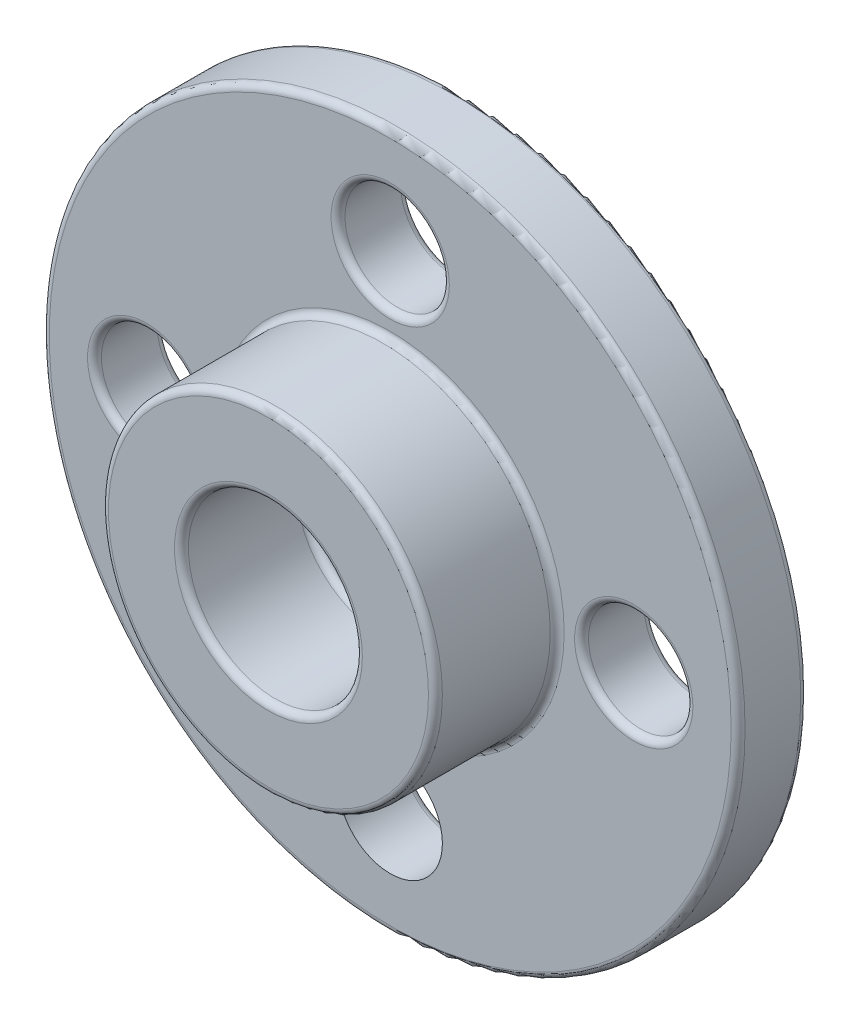
ISO-10303-21;
HEADER;
FILE_DESCRIPTION(('STEP AP214'),'2;1');
FILE_NAME('part.step','',(''),(''),'','','');
FILE_SCHEMA(('AUTOMOTIVE_DESIGN { 1 0 10303 214 1 1 1 1 }'));
ENDSEC;
DATA;
#1=APPLICATION_CONTEXT('core data for automotive mechanical design processes');
#2=APPLICATION_PROTOCOL_DEFINITION('international standard','automotive_design',2000,#1);
#3=PRODUCT_CONTEXT('',#1,'mechanical');
#4=PRODUCT('Part','Part','',(#3));
#5=PRODUCT_RELATED_PRODUCT_CATEGORY('part','',(#4));
#6=PRODUCT_DEFINITION_FORMATION('','',#4);
#7=PRODUCT_DEFINITION_CONTEXT('part definition',#1,'design');
#8=PRODUCT_DEFINITION('design','',#6,#7);
#9=PRODUCT_DEFINITION_SHAPE('','',#8);
#10=(LENGTH_UNIT() NAMED_UNIT(*) SI_UNIT(.MILLI.,.METRE.));
#11=(NAMED_UNIT(*) PLANE_ANGLE_UNIT() SI_UNIT($,.RADIAN.));
#12=(NAMED_UNIT(*) SI_UNIT($,.STERADIAN.) SOLID_ANGLE_UNIT());
#13=UNCERTAINTY_MEASURE_WITH_UNIT(LENGTH_MEASURE(1.E-05),#10,'distance_accuracy_value','');
#14=(GEOMETRIC_REPRESENTATION_CONTEXT(3) GLOBAL_UNCERTAINTY_ASSIGNED_CONTEXT((#13)) GLOBAL_UNIT_ASSIGNED_CONTEXT((#10,
#11,#12)) REPRESENTATION_CONTEXT('',''));
#15=CARTESIAN_POINT('',(0.,0.,0.));
#16=DIRECTION('',(0.,0.,1.));
#17=DIRECTION('',(1.,0.,0.));
#18=AXIS2_PLACEMENT_3D('',#15,#16,#17);
#19=CARTESIAN_POINT('',(0.,0.,2.));
#20=DIRECTION('',(0.,0.,-1.));
#21=DIRECTION('',(-1.,0.,0.));
#22=AXIS2_PLACEMENT_3D('',#19,#20,#21);
#23=CYLINDRICAL_SURFACE('',#22,1.65);
#24=CARTESIAN_POINT('',(0.,0.,1.8));
#25=DIRECTION('',(0.,0.,1.));
#26=DIRECTION('',(1.,0.,0.));
#27=AXIS2_PLACEMENT_3D('',#24,#25,#26);
#28=CIRCLE('',#27,1.65);
#29=CARTESIAN_POINT('',(1.65,0.,1.8));
#30=VERTEX_POINT('',#29);
#31=EDGE_CURVE('E89',#30,#30,#28,.T.);
#32=ORIENTED_EDGE('',*,*,#31,.T.);
#33=EDGE_LOOP('',(#32));
#34=FACE_BOUND('',#33,.T.);
#35=CARTESIAN_POINT('',(0.,0.,0.2));
#36=DIRECTION('',(0.,0.,1.));
#37=DIRECTION('',(1.,0.,0.));
#38=AXIS2_PLACEMENT_3D('',#35,#36,#37);
#39=CIRCLE('',#38,1.65);
#40=CARTESIAN_POINT('',(1.65,0.,0.2));
#41=VERTEX_POINT('',#40);
#42=EDGE_CURVE('E92',#41,#41,#39,.F.);
#43=ORIENTED_EDGE('',*,*,#42,.T.);
#44=EDGE_LOOP('',(#43));
#45=FACE_BOUND('',#44,.T.);
#46=ADVANCED_FACE('F42',(#34,#45),#23,.F.);
#47=CARTESIAN_POINT('',(0.,0.,2.));
#48=DIRECTION('',(0.,0.,1.));
#49=DIRECTION('',(1.,0.,0.));
#50=AXIS2_PLACEMENT_3D('',#47,#48,#49);
#51=PLANE('',#50);
#52=CARTESIAN_POINT('',(0.,0.,2.));
#53=DIRECTION('',(0.,0.,1.));
#54=DIRECTION('',(1.,0.,0.));
#55=AXIS2_PLACEMENT_3D('',#52,#53,#54);
#56=CIRCLE('',#55,1.85);
#57=CARTESIAN_POINT('',(1.85,0.,2.));
#58=VERTEX_POINT('',#57);
#59=EDGE_CURVE('E83',#58,#58,#56,.F.);
#60=ORIENTED_EDGE('',*,*,#59,.T.);
#61=EDGE_LOOP('',(#60));
#62=FACE_BOUND('',#61,.T.);
#63=CARTESIAN_POINT('',(0.,0.,2.));
#64=DIRECTION('',(0.,0.,1.));
#65=DIRECTION('',(1.,0.,0.));
#66=AXIS2_PLACEMENT_3D('',#63,#64,#65);
#67=CIRCLE('',#66,2.3);
#68=CARTESIAN_POINT('',(2.3,0.,2.));
#69=VERTEX_POINT('',#68);
#70=EDGE_CURVE('E86',#69,#69,#67,.T.);
#71=ORIENTED_EDGE('',*,*,#70,.T.);
#72=EDGE_LOOP('',(#71));
#73=FACE_BOUND('',#72,.T.);
#74=ADVANCED_FACE('F164',(#62,#73),#51,.T.);
#75=CARTESIAN_POINT('',(0.,0.,0.));
#76=DIRECTION('',(0.,0.,1.));
#77=DIRECTION('',(1.,0.,0.));
#78=AXIS2_PLACEMENT_3D('',#75,#76,#77);
#79=PLANE('',#78);
#80=CARTESIAN_POINT('',(-7.,0.,0.));
#81=DIRECTION('',(0.,0.,1.));
#82=DIRECTION('',(1.,0.,0.));
#83=AXIS2_PLACEMENT_3D('',#80,#81,#82);
#84=CIRCLE('',#83,1.70000000000007);
#85=CARTESIAN_POINT('',(-5.29999999999993,0.,0.));
#86=VERTEX_POINT('',#85);
#87=EDGE_CURVE('E49',#86,#86,#84,.T.);
#88=ORIENTED_EDGE('',*,*,#87,.T.);
#89=EDGE_LOOP('',(#88));
#90=FACE_BOUND('',#89,.T.);
#91=CARTESIAN_POINT('',(0.,7.,0.));
#92=DIRECTION('',(0.,0.,1.));
#93=DIRECTION('',(1.,0.,0.));
#94=AXIS2_PLACEMENT_3D('',#91,#92,#93);
#95=CIRCLE('',#94,1.7);
#96=CARTESIAN_POINT('',(1.7,7.,0.));
#97=VERTEX_POINT('',#96);
#98=EDGE_CURVE('E53',#97,#97,#95,.T.);
#99=ORIENTED_EDGE('',*,*,#98,.T.);
#100=EDGE_LOOP('',(#99));
#101=FACE_BOUND('',#100,.T.);
#102=CARTESIAN_POINT('',(7.,0.,0.));
#103=DIRECTION('',(0.,0.,1.));
#104=DIRECTION('',(1.,0.,0.));
#105=AXIS2_PLACEMENT_3D('',#102,#103,#104);
#106=CIRCLE('',#105,1.70000000000002);
#107=CARTESIAN_POINT('',(8.70000000000002,0.,0.));
#108=VERTEX_POINT('',#107);
#109=EDGE_CURVE('E57',#108,#108,#106,.T.);
#110=ORIENTED_EDGE('',*,*,#109,.T.);
#111=EDGE_LOOP('',(#110));
#112=FACE_BOUND('',#111,.T.);
#113=CARTESIAN_POINT('',(0.,-7.,0.));
#114=DIRECTION('',(0.,0.,1.));
#115=DIRECTION('',(1.,0.,0.));
#116=AXIS2_PLACEMENT_3D('',#113,#114,#115);
#117=CIRCLE('',#116,1.70000000000005);
#118=CARTESIAN_POINT('',(1.70000000000005,-7.,0.));
#119=VERTEX_POINT('',#118);
#120=EDGE_CURVE('E62',#119,#119,#117,.T.);
#121=ORIENTED_EDGE('',*,*,#120,.T.);
#122=EDGE_LOOP('',(#121));
#123=FACE_BOUND('',#122,.T.);
#124=CARTESIAN_POINT('',(0.,0.,0.));
#125=DIRECTION('',(0.,0.,1.));
#126=DIRECTION('',(1.,0.,0.));
#127=AXIS2_PLACEMENT_3D('',#124,#125,#126);
#128=CIRCLE('',#127,1.85);
#129=CARTESIAN_POINT('',(1.85,0.,0.));
#130=VERTEX_POINT('',#129);
#131=EDGE_CURVE('E65',#130,#130,#128,.T.);
#132=ORIENTED_EDGE('',*,*,#131,.T.);
#133=EDGE_LOOP('',(#132));
#134=FACE_BOUND('',#133,.T.);
#135=CARTESIAN_POINT('',(0.,0.,0.));
#136=DIRECTION('',(0.,0.,1.));
#137=DIRECTION('',(1.,0.,0.));
#138=AXIS2_PLACEMENT_3D('',#135,#136,#137);
#139=CIRCLE('',#138,9.8);
#140=CARTESIAN_POINT('',(9.8,0.,0.));
#141=VERTEX_POINT('',#140);
#142=EDGE_CURVE('E68',#141,#141,#139,.F.);
#143=ORIENTED_EDGE('',*,*,#142,.T.);
#144=EDGE_LOOP('',(#143));
#145=FACE_BOUND('',#144,.T.);
#146=ADVANCED_FACE('F170',(#90,#101,#112,#123,#134,#145),#79,.F.);
#147=CARTESIAN_POINT('',(0.,0.,5.5));
#148=DIRECTION('',(0.,0.,-1.));
#149=DIRECTION('',(-1.,0.,0.));
#150=AXIS2_PLACEMENT_3D('',#147,#148,#149);
#151=CYLINDRICAL_SURFACE('',#150,2.5);
#152=CARTESIAN_POINT('',(0.,0.,2.2));
#153=DIRECTION('',(0.,0.,1.));
#154=DIRECTION('',(1.,0.,0.));
#155=AXIS2_PLACEMENT_3D('',#152,#153,#154);
#156=CIRCLE('',#155,2.5);
#157=CARTESIAN_POINT('',(2.5,0.,2.2));
#158=VERTEX_POINT('',#157);
#159=EDGE_CURVE('E77',#158,#158,#156,.F.);
#160=ORIENTED_EDGE('',*,*,#159,.T.);
#161=EDGE_LOOP('',(#160));
#162=FACE_BOUND('',#161,.T.);
#163=CARTESIAN_POINT('',(0.,0.,5.3));
#164=DIRECTION('',(0.,0.,1.));
#165=DIRECTION('',(1.,0.,0.));
#166=AXIS2_PLACEMENT_3D('',#163,#164,#165);
#167=CIRCLE('',#166,2.5);
#168=CARTESIAN_POINT('',(2.5,0.,5.3));
#169=VERTEX_POINT('',#168);
#170=EDGE_CURVE('E80',#169,#169,#167,.T.);
#171=ORIENTED_EDGE('',*,*,#170,.T.);
#172=EDGE_LOOP('',(#171));
#173=FACE_BOUND('',#172,.T.);
#174=ADVANCED_FACE('F235',(#162,#173),#151,.F.);
#175=CARTESIAN_POINT('',(0.,0.,5.5));
#176=DIRECTION('',(0.,0.,-1.));
#177=DIRECTION('',(-1.,0.,0.));
#178=AXIS2_PLACEMENT_3D('',#175,#176,#177);
#179=CYLINDRICAL_SURFACE('',#178,4.8);
#180=CARTESIAN_POINT('',(0.,0.,2.2));
#181=DIRECTION('',(0.,0.,1.));
#182=DIRECTION('',(1.,0.,0.));
#183=AXIS2_PLACEMENT_3D('',#180,#181,#182);
#184=CIRCLE('',#183,4.8);
#185=CARTESIAN_POINT('',(4.8,0.,2.2));
#186=VERTEX_POINT('',#185);
#187=EDGE_CURVE('E95',#186,#186,#184,.T.);
#188=ORIENTED_EDGE('',*,*,#187,.T.);
#189=EDGE_LOOP('',(#188));
#190=FACE_BOUND('',#189,.T.);
#191=CARTESIAN_POINT('',(0.,0.,5.3));
#192=DIRECTION('',(0.,0.,1.));
#193=DIRECTION('',(1.,0.,0.));
#194=AXIS2_PLACEMENT_3D('',#191,#192,#193);
#195=CIRCLE('',#194,4.8);
#196=CARTESIAN_POINT('',(4.8,0.,5.3));
#197=VERTEX_POINT('',#196);
#198=EDGE_CURVE('E98',#197,#197,#195,.F.);
#199=ORIENTED_EDGE('',*,*,#198,.T.);
#200=EDGE_LOOP('',(#199));
#201=FACE_BOUND('',#200,.T.);
#202=ADVANCED_FACE('F239',(#190,#201),#179,.T.);
#203=CARTESIAN_POINT('',(0.,0.,5.5));
#204=DIRECTION('',(0.,0.,1.));
#205=DIRECTION('',(1.,0.,0.));
#206=AXIS2_PLACEMENT_3D('',#203,#204,#205);
#207=PLANE('',#206);
#208=CARTESIAN_POINT('',(0.,0.,5.5));
#209=DIRECTION('',(0.,0.,1.));
#210=DIRECTION('',(1.,0.,0.));
#211=AXIS2_PLACEMENT_3D('',#208,#209,#210);
#212=CIRCLE('',#211,2.7);
#213=CARTESIAN_POINT('',(2.7,0.,5.5));
#214=VERTEX_POINT('',#213);
#215=EDGE_CURVE('E71',#214,#214,#212,.F.);
#216=ORIENTED_EDGE('',*,*,#215,.T.);
#217=EDGE_LOOP('',(#216));
#218=FACE_BOUND('',#217,.T.);
#219=CARTESIAN_POINT('',(0.,0.,5.5));
#220=DIRECTION('',(0.,0.,1.));
#221=DIRECTION('',(1.,0.,0.));
#222=AXIS2_PLACEMENT_3D('',#219,#220,#221);
#223=CIRCLE('',#222,4.6);
#224=CARTESIAN_POINT('',(4.6,0.,5.5));
#225=VERTEX_POINT('',#224);
#226=EDGE_CURVE('E74',#225,#225,#223,.T.);
#227=ORIENTED_EDGE('',*,*,#226,.T.);
#228=EDGE_LOOP('',(#227));
#229=FACE_BOUND('',#228,.T.);
#230=ADVANCED_FACE('F257',(#218,#229),#207,.T.);
#231=CARTESIAN_POINT('',(0.,7.,2.));
#232=DIRECTION('',(0.,0.,-1.));
#233=DIRECTION('',(-1.,0.,0.));
#234=AXIS2_PLACEMENT_3D('',#231,#232,#233);
#235=CYLINDRICAL_SURFACE('',#234,1.5);
#236=CARTESIAN_POINT('',(0.,7.,1.8));
#237=DIRECTION('',(0.,0.,1.));
#238=DIRECTION('',(1.,0.,0.));
#239=AXIS2_PLACEMENT_3D('',#236,#237,#238);
#240=CIRCLE('',#239,1.5);
#241=CARTESIAN_POINT('',(1.5,7.,1.8));
#242=VERTEX_POINT('',#241);
#243=EDGE_CURVE('E107',#242,#242,#240,.T.);
#244=ORIENTED_EDGE('',*,*,#243,.T.);
#245=EDGE_LOOP('',(#244));
#246=FACE_BOUND('',#245,.T.);
#247=CARTESIAN_POINT('',(0.,7.,0.2));
#248=DIRECTION('',(0.,0.,1.));
#249=DIRECTION('',(1.,0.,0.));
#250=AXIS2_PLACEMENT_3D('',#247,#248,#249);
#251=CIRCLE('',#250,1.5);
#252=CARTESIAN_POINT('',(1.5,7.,0.2));
#253=VERTEX_POINT('',#252);
#254=EDGE_CURVE('E110',#253,#253,#251,.F.);
#255=ORIENTED_EDGE('',*,*,#254,.T.);
#256=EDGE_LOOP('',(#255));
#257=FACE_BOUND('',#256,.T.);
#258=ADVANCED_FACE('F264',(#246,#257),#235,.F.);
#259=CARTESIAN_POINT('',(7.,0.,2.));
#260=DIRECTION('',(0.,0.,-1.));
#261=DIRECTION('',(-1.,0.,0.));
#262=AXIS2_PLACEMENT_3D('',#259,#260,#261);
#263=CYLINDRICAL_SURFACE('',#262,1.50000000000002);
#264=CARTESIAN_POINT('',(7.,0.,1.8));
#265=DIRECTION('',(0.,0.,1.));
#266=DIRECTION('',(1.,0.,0.));
#267=AXIS2_PLACEMENT_3D('',#264,#265,#266);
#268=CIRCLE('',#267,1.50000000000002);
#269=CARTESIAN_POINT('',(8.50000000000002,0.,1.8));
#270=VERTEX_POINT('',#269);
#271=EDGE_CURVE('E134',#270,#270,#268,.T.);
#272=ORIENTED_EDGE('',*,*,#271,.T.);
#273=EDGE_LOOP('',(#272));
#274=FACE_BOUND('',#273,.T.);
#275=CARTESIAN_POINT('',(7.,0.,0.2));
#276=DIRECTION('',(0.,0.,1.));
#277=DIRECTION('',(1.,0.,0.));
#278=AXIS2_PLACEMENT_3D('',#275,#276,#277);
#279=CIRCLE('',#278,1.50000000000002);
#280=CARTESIAN_POINT('',(8.50000000000002,0.,0.2));
#281=VERTEX_POINT('',#280);
#282=EDGE_CURVE('E137',#281,#281,#279,.F.);
#283=ORIENTED_EDGE('',*,*,#282,.T.);
#284=EDGE_LOOP('',(#283));
#285=FACE_BOUND('',#284,.T.);
#286=ADVANCED_FACE('F271',(#274,#285),#263,.F.);
#287=CARTESIAN_POINT('',(0.,-7.,2.));
#288=DIRECTION('',(0.,0.,-1.));
#289=DIRECTION('',(-1.,0.,0.));
#290=AXIS2_PLACEMENT_3D('',#287,#288,#289);
#291=CYLINDRICAL_SURFACE('',#290,1.50000000000005);
#292=CARTESIAN_POINT('',(0.,-7.,0.2));
#293=DIRECTION('',(0.,0.,1.));
#294=DIRECTION('',(1.,0.,0.));
#295=AXIS2_PLACEMENT_3D('',#292,#293,#294);
#296=CIRCLE('',#295,1.50000000000005);
#297=CARTESIAN_POINT('',(1.50000000000005,-7.,0.2));
#298=VERTEX_POINT('',#297);
#299=EDGE_CURVE('E11',#298,#298,#296,.F.);
#300=ORIENTED_EDGE('',*,*,#299,.T.);
#301=EDGE_LOOP('',(#300));
#302=FACE_BOUND('',#301,.T.);
#303=CARTESIAN_POINT('',(0.,-7.,2.));
#304=DIRECTION('',(0.,0.,1.));
#305=DIRECTION('',(1.,0.,0.));
#306=AXIS2_PLACEMENT_3D('',#303,#304,#305);
#307=CIRCLE('',#306,1.50000000000005);
#308=CARTESIAN_POINT('',(1.50000000000005,-7.,2.));
#309=VERTEX_POINT('',#308);
#310=EDGE_CURVE('E140',#309,#309,#307,.T.);
#311=ORIENTED_EDGE('',*,*,#310,.T.);
#312=EDGE_LOOP('',(#311));
#313=FACE_BOUND('',#312,.T.);
#314=ADVANCED_FACE('F144',(#302,#313),#291,.F.);
#315=CARTESIAN_POINT('',(-7.,0.,2.));
#316=DIRECTION('',(0.,0.,-1.));
#317=DIRECTION('',(-1.,0.,0.));
#318=AXIS2_PLACEMENT_3D('',#315,#316,#317);
#319=CYLINDRICAL_SURFACE('',#318,1.50000000000007);
#320=CARTESIAN_POINT('',(-7.,0.,1.8));
#321=DIRECTION('',(0.,0.,1.));
#322=DIRECTION('',(1.,0.,0.));
#323=AXIS2_PLACEMENT_3D('',#320,#321,#322);
#324=CIRCLE('',#323,1.50000000000007);
#325=CARTESIAN_POINT('',(-5.49999999999993,0.,1.8));
#326=VERTEX_POINT('',#325);
#327=EDGE_CURVE('E113',#326,#326,#324,.T.);
#328=ORIENTED_EDGE('',*,*,#327,.T.);
#329=EDGE_LOOP('',(#328));
#330=FACE_BOUND('',#329,.T.);
#331=CARTESIAN_POINT('',(-7.,0.,0.2));
#332=DIRECTION('',(0.,0.,1.));
#333=DIRECTION('',(1.,0.,0.));
#334=AXIS2_PLACEMENT_3D('',#331,#332,#333);
#335=CIRCLE('',#334,1.50000000000007);
#336=CARTESIAN_POINT('',(-5.49999999999993,0.,0.2));
#337=VERTEX_POINT('',#336);
#338=EDGE_CURVE('E116',#337,#337,#335,.F.);
#339=ORIENTED_EDGE('',*,*,#338,.T.);
#340=EDGE_LOOP('',(#339));
#341=FACE_BOUND('',#340,.T.);
#342=ADVANCED_FACE('F159',(#330,#341),#319,.F.);
#343=CARTESIAN_POINT('',(0.,0.,2.));
#344=DIRECTION('',(0.,0.,-1.));
#345=DIRECTION('',(-1.,0.,0.));
#346=AXIS2_PLACEMENT_3D('',#343,#344,#345);
#347=CYLINDRICAL_SURFACE('',#346,10.);
#348=CARTESIAN_POINT('',(0.,0.,1.8));
#349=DIRECTION('',(0.,0.,1.));
#350=DIRECTION('',(1.,0.,0.));
#351=AXIS2_PLACEMENT_3D('',#348,#349,#350);
#352=CIRCLE('',#351,10.);
#353=CARTESIAN_POINT('',(10.,0.,1.8));
#354=VERTEX_POINT('',#353);
#355=EDGE_CURVE('E101',#354,#354,#352,.F.);
#356=ORIENTED_EDGE('',*,*,#355,.T.);
#357=EDGE_LOOP('',(#356));
#358=FACE_BOUND('',#357,.T.);
#359=CARTESIAN_POINT('',(0.,0.,0.2));
#360=DIRECTION('',(0.,0.,1.));
#361=DIRECTION('',(1.,0.,0.));
#362=AXIS2_PLACEMENT_3D('',#359,#360,#361);
#363=CIRCLE('',#362,10.);
#364=CARTESIAN_POINT('',(10.,0.,0.2));
#365=VERTEX_POINT('',#364);
#366=EDGE_CURVE('E104',#365,#365,#363,.T.);
#367=ORIENTED_EDGE('',*,*,#366,.T.);
#368=EDGE_LOOP('',(#367));
#369=FACE_BOUND('',#368,.T.);
#370=ADVANCED_FACE('F149',(#358,#369),#347,.T.);
#371=CARTESIAN_POINT('',(0.,0.,2.));
#372=DIRECTION('',(0.,0.,1.));
#373=DIRECTION('',(1.,0.,0.));
#374=AXIS2_PLACEMENT_3D('',#371,#372,#373);
#375=PLANE('',#374);
#376=CARTESIAN_POINT('',(7.,0.,2.));
#377=DIRECTION('',(0.,0.,1.));
#378=DIRECTION('',(1.,0.,0.));
#379=AXIS2_PLACEMENT_3D('',#376,#377,#378);
#380=CIRCLE('',#379,1.70000000000002);
#381=CARTESIAN_POINT('',(8.70000000000002,0.,2.));
#382=VERTEX_POINT('',#381);
#383=EDGE_CURVE('E119',#382,#382,#380,.F.);
#384=ORIENTED_EDGE('',*,*,#383,.T.);
#385=EDGE_LOOP('',(#384));
#386=FACE_BOUND('',#385,.T.);
#387=CARTESIAN_POINT('',(-7.,0.,2.));
#388=DIRECTION('',(0.,0.,1.));
#389=DIRECTION('',(1.,0.,0.));
#390=AXIS2_PLACEMENT_3D('',#387,#388,#389);
#391=CIRCLE('',#390,1.70000000000007);
#392=CARTESIAN_POINT('',(-5.29999999999993,0.,2.));
#393=VERTEX_POINT('',#392);
#394=EDGE_CURVE('E122',#393,#393,#391,.F.);
#395=ORIENTED_EDGE('',*,*,#394,.T.);
#396=EDGE_LOOP('',(#395));
#397=FACE_BOUND('',#396,.T.);
#398=CARTESIAN_POINT('',(0.,7.,2.));
#399=DIRECTION('',(0.,0.,1.));
#400=DIRECTION('',(1.,0.,0.));
#401=AXIS2_PLACEMENT_3D('',#398,#399,#400);
#402=CIRCLE('',#401,1.7);
#403=CARTESIAN_POINT('',(1.7,7.,2.));
#404=VERTEX_POINT('',#403);
#405=EDGE_CURVE('E125',#404,#404,#402,.F.);
#406=ORIENTED_EDGE('',*,*,#405,.T.);
#407=EDGE_LOOP('',(#406));
#408=FACE_BOUND('',#407,.T.);
#409=CARTESIAN_POINT('',(0.,0.,2.));
#410=DIRECTION('',(0.,0.,1.));
#411=DIRECTION('',(1.,0.,0.));
#412=AXIS2_PLACEMENT_3D('',#409,#410,#411);
#413=CIRCLE('',#412,9.8);
#414=CARTESIAN_POINT('',(9.8,0.,2.));
#415=VERTEX_POINT('',#414);
#416=EDGE_CURVE('E128',#415,#415,#413,.T.);
#417=ORIENTED_EDGE('',*,*,#416,.T.);
#418=EDGE_LOOP('',(#417));
#419=FACE_BOUND('',#418,.T.);
#420=CARTESIAN_POINT('',(0.,0.,2.));
#421=DIRECTION('',(0.,0.,1.));
#422=DIRECTION('',(1.,0.,0.));
#423=AXIS2_PLACEMENT_3D('',#420,#421,#422);
#424=CIRCLE('',#423,5.);
#425=CARTESIAN_POINT('',(5.,0.,2.));
#426=VERTEX_POINT('',#425);
#427=EDGE_CURVE('E131',#426,#426,#424,.F.);
#428=ORIENTED_EDGE('',*,*,#427,.T.);
#429=EDGE_LOOP('',(#428));
#430=FACE_BOUND('',#429,.T.);
#431=ORIENTED_EDGE('',*,*,#310,.F.);
#432=EDGE_LOOP('',(#431));
#433=FACE_BOUND('',#432,.T.);
#434=ADVANCED_FACE('F146',(#386,#397,#408,#419,#430,#433),#375,.T.);
#435=CARTESIAN_POINT('',(7.,0.,1.8));
#436=DIRECTION('',(0.,0.,1.));
#437=DIRECTION('',(1.,0.,0.));
#438=AXIS2_PLACEMENT_3D('',#435,#436,#437);
#439=TOROIDAL_SURFACE('',#438,1.70000000000002,0.2);
#440=ORIENTED_EDGE('',*,*,#383,.F.);
#441=EDGE_LOOP('',(#440));
#442=FACE_BOUND('',#441,.T.);
#443=ORIENTED_EDGE('',*,*,#271,.F.);
#444=EDGE_LOOP('',(#443));
#445=FACE_BOUND('',#444,.T.);
#446=ADVANCED_FACE('F148',(#442,#445),#439,.T.);
#447=CARTESIAN_POINT('',(-7.,0.,1.8));
#448=DIRECTION('',(0.,0.,1.));
#449=DIRECTION('',(1.,0.,0.));
#450=AXIS2_PLACEMENT_3D('',#447,#448,#449);
#451=TOROIDAL_SURFACE('',#450,1.70000000000007,0.2);
#452=ORIENTED_EDGE('',*,*,#394,.F.);
#453=EDGE_LOOP('',(#452));
#454=FACE_BOUND('',#453,.T.);
#455=ORIENTED_EDGE('',*,*,#327,.F.);
#456=EDGE_LOOP('',(#455));
#457=FACE_BOUND('',#456,.T.);
#458=ADVANCED_FACE('F156',(#454,#457),#451,.T.);
#459=CARTESIAN_POINT('',(0.,7.,1.8));
#460=DIRECTION('',(0.,0.,1.));
#461=DIRECTION('',(1.,0.,0.));
#462=AXIS2_PLACEMENT_3D('',#459,#460,#461);
#463=TOROIDAL_SURFACE('',#462,1.7,0.2);
#464=ORIENTED_EDGE('',*,*,#405,.F.);
#465=EDGE_LOOP('',(#464));
#466=FACE_BOUND('',#465,.T.);
#467=ORIENTED_EDGE('',*,*,#243,.F.);
#468=EDGE_LOOP('',(#467));
#469=FACE_BOUND('',#468,.T.);
#470=ADVANCED_FACE('F178',(#466,#469),#463,.T.);
#471=CARTESIAN_POINT('',(0.,0.,1.8));
#472=DIRECTION('',(0.,0.,1.));
#473=DIRECTION('',(1.,0.,0.));
#474=AXIS2_PLACEMENT_3D('',#471,#472,#473);
#475=TOROIDAL_SURFACE('',#474,9.8,0.2);
#476=ORIENTED_EDGE('',*,*,#355,.F.);
#477=EDGE_LOOP('',(#476));
#478=FACE_BOUND('',#477,.T.);
#479=ORIENTED_EDGE('',*,*,#416,.F.);
#480=EDGE_LOOP('',(#479));
#481=FACE_BOUND('',#480,.T.);
#482=ADVANCED_FACE('F182',(#478,#481),#475,.T.);
#483=CARTESIAN_POINT('',(0.,0.,2.2));
#484=DIRECTION('',(0.,0.,1.));
#485=DIRECTION('',(1.,0.,0.));
#486=AXIS2_PLACEMENT_3D('',#483,#484,#485);
#487=TOROIDAL_SURFACE('',#486,5.,0.2);
#488=ORIENTED_EDGE('',*,*,#427,.F.);
#489=EDGE_LOOP('',(#488));
#490=FACE_BOUND('',#489,.T.);
#491=ORIENTED_EDGE('',*,*,#187,.F.);
#492=EDGE_LOOP('',(#491));
#493=FACE_BOUND('',#492,.T.);
#494=ADVANCED_FACE('F186',(#490,#493),#487,.F.);
#495=CARTESIAN_POINT('',(0.,0.,1.8));
#496=DIRECTION('',(0.,0.,1.));
#497=DIRECTION('',(1.,0.,0.));
#498=AXIS2_PLACEMENT_3D('',#495,#496,#497);
#499=TOROIDAL_SURFACE('',#498,1.85,0.2);
#500=ORIENTED_EDGE('',*,*,#59,.F.);
#501=EDGE_LOOP('',(#500));
#502=FACE_BOUND('',#501,.T.);
#503=ORIENTED_EDGE('',*,*,#31,.F.);
#504=EDGE_LOOP('',(#503));
#505=FACE_BOUND('',#504,.T.);
#506=ADVANCED_FACE('F190',(#502,#505),#499,.T.);
#507=CARTESIAN_POINT('',(0.,0.,2.2));
#508=DIRECTION('',(0.,0.,1.));
#509=DIRECTION('',(1.,0.,0.));
#510=AXIS2_PLACEMENT_3D('',#507,#508,#509);
#511=TOROIDAL_SURFACE('',#510,2.3,0.2);
#512=ORIENTED_EDGE('',*,*,#70,.F.);
#513=EDGE_LOOP('',(#512));
#514=FACE_BOUND('',#513,.T.);
#515=ORIENTED_EDGE('',*,*,#159,.F.);
#516=EDGE_LOOP('',(#515));
#517=FACE_BOUND('',#516,.T.);
#518=ADVANCED_FACE('F194',(#514,#517),#511,.F.);
#519=CARTESIAN_POINT('',(0.,0.,5.3));
#520=DIRECTION('',(0.,0.,1.));
#521=DIRECTION('',(1.,0.,0.));
#522=AXIS2_PLACEMENT_3D('',#519,#520,#521);
#523=TOROIDAL_SURFACE('',#522,2.7,0.2);
#524=ORIENTED_EDGE('',*,*,#215,.F.);
#525=EDGE_LOOP('',(#524));
#526=FACE_BOUND('',#525,.T.);
#527=ORIENTED_EDGE('',*,*,#170,.F.);
#528=EDGE_LOOP('',(#527));
#529=FACE_BOUND('',#528,.T.);
#530=ADVANCED_FACE('F198',(#526,#529),#523,.T.);
#531=CARTESIAN_POINT('',(-7.,0.,0.2));
#532=DIRECTION('',(0.,0.,1.));
#533=DIRECTION('',(1.,0.,0.));
#534=AXIS2_PLACEMENT_3D('',#531,#532,#533);
#535=TOROIDAL_SURFACE('',#534,1.70000000000007,0.2);
#536=ORIENTED_EDGE('',*,*,#338,.F.);
#537=EDGE_LOOP('',(#536));
#538=FACE_BOUND('',#537,.T.);
#539=ORIENTED_EDGE('',*,*,#87,.F.);
#540=EDGE_LOOP('',(#539));
#541=FACE_BOUND('',#540,.T.);
#542=ADVANCED_FACE('F202',(#538,#541),#535,.T.);
#543=CARTESIAN_POINT('',(0.,7.,0.2));
#544=DIRECTION('',(0.,0.,1.));
#545=DIRECTION('',(1.,0.,0.));
#546=AXIS2_PLACEMENT_3D('',#543,#544,#545);
#547=TOROIDAL_SURFACE('',#546,1.7,0.2);
#548=ORIENTED_EDGE('',*,*,#254,.F.);
#549=EDGE_LOOP('',(#548));
#550=FACE_BOUND('',#549,.T.);
#551=ORIENTED_EDGE('',*,*,#98,.F.);
#552=EDGE_LOOP('',(#551));
#553=FACE_BOUND('',#552,.T.);
#554=ADVANCED_FACE('F206',(#550,#553),#547,.T.);
#555=CARTESIAN_POINT('',(7.,0.,0.2));
#556=DIRECTION('',(0.,0.,1.));
#557=DIRECTION('',(1.,0.,0.));
#558=AXIS2_PLACEMENT_3D('',#555,#556,#557);
#559=TOROIDAL_SURFACE('',#558,1.70000000000002,0.2);
#560=ORIENTED_EDGE('',*,*,#282,.F.);
#561=EDGE_LOOP('',(#560));
#562=FACE_BOUND('',#561,.T.);
#563=ORIENTED_EDGE('',*,*,#109,.F.);
#564=EDGE_LOOP('',(#563));
#565=FACE_BOUND('',#564,.T.);
#566=ADVANCED_FACE('F210',(#562,#565),#559,.T.);
#567=CARTESIAN_POINT('',(0.,-7.,0.2));
#568=DIRECTION('',(0.,0.,1.));
#569=DIRECTION('',(1.,0.,0.));
#570=AXIS2_PLACEMENT_3D('',#567,#568,#569);
#571=TOROIDAL_SURFACE('',#570,1.70000000000005,0.2);
#572=ORIENTED_EDGE('',*,*,#299,.F.);
#573=EDGE_LOOP('',(#572));
#574=FACE_BOUND('',#573,.T.);
#575=ORIENTED_EDGE('',*,*,#120,.F.);
#576=EDGE_LOOP('',(#575));
#577=FACE_BOUND('',#576,.T.);
#578=ADVANCED_FACE('F214',(#574,#577),#571,.T.);
#579=CARTESIAN_POINT('',(0.,0.,0.2));
#580=DIRECTION('',(0.,0.,1.));
#581=DIRECTION('',(1.,0.,0.));
#582=AXIS2_PLACEMENT_3D('',#579,#580,#581);
#583=TOROIDAL_SURFACE('',#582,1.85,0.2);
#584=ORIENTED_EDGE('',*,*,#42,.F.);
#585=EDGE_LOOP('',(#584));
#586=FACE_BOUND('',#585,.T.);
#587=ORIENTED_EDGE('',*,*,#131,.F.);
#588=EDGE_LOOP('',(#587));
#589=FACE_BOUND('',#588,.T.);
#590=ADVANCED_FACE('F218',(#586,#589),#583,.T.);
#591=CARTESIAN_POINT('',(0.,0.,0.2));
#592=DIRECTION('',(0.,0.,1.));
#593=DIRECTION('',(1.,0.,0.));
#594=AXIS2_PLACEMENT_3D('',#591,#592,#593);
#595=TOROIDAL_SURFACE('',#594,9.8,0.2);
#596=ORIENTED_EDGE('',*,*,#142,.F.);
#597=EDGE_LOOP('',(#596));
#598=FACE_BOUND('',#597,.T.);
#599=ORIENTED_EDGE('',*,*,#366,.F.);
#600=EDGE_LOOP('',(#599));
#601=FACE_BOUND('',#600,.T.);
#602=ADVANCED_FACE('F221',(#598,#601),#595,.T.);
#603=CARTESIAN_POINT('',(0.,0.,5.3));
#604=DIRECTION('',(0.,0.,1.));
#605=DIRECTION('',(1.,0.,0.));
#606=AXIS2_PLACEMENT_3D('',#603,#604,#605);
#607=TOROIDAL_SURFACE('',#606,4.6,0.2);
#608=ORIENTED_EDGE('',*,*,#198,.F.);
#609=EDGE_LOOP('',(#608));
#610=FACE_BOUND('',#609,.T.);
#611=ORIENTED_EDGE('',*,*,#226,.F.);
#612=EDGE_LOOP('',(#611));
#613=FACE_BOUND('',#612,.T.);
#614=ADVANCED_FACE('F44',(#610,#613),#607,.T.);
#615=CLOSED_SHELL('',(#46,#74,#146,#174,#202,#230,#258,#286,#314,#342,#370,#434,#446,#458,#470,
#482,#494,#506,#518,#530,#542,#554,#566,#578,#590,#602,#614));
#616=MANIFOLD_SOLID_BREP('B2',#615);
#617=ADVANCED_BREP_SHAPE_REPRESENTATION('',(#18,#616),#14);
#618=SHAPE_DEFINITION_REPRESENTATION(#9,#617);
ENDSEC;
END-ISO-10303-21;
